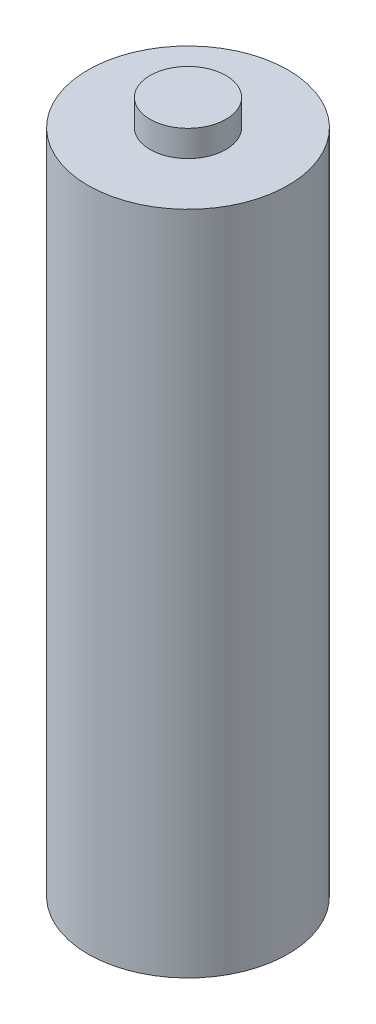
ISO-10303-21;
HEADER;
FILE_DESCRIPTION(('STEP AP214'),'2;1');
FILE_NAME('part.step','',(''),(''),'','','');
FILE_SCHEMA(('AUTOMOTIVE_DESIGN { 1 0 10303 214 1 1 1 1 }'));
ENDSEC;
DATA;
#1=APPLICATION_CONTEXT('core data for automotive mechanical design processes');
#2=APPLICATION_PROTOCOL_DEFINITION('international standard','automotive_design',2000,#1);
#3=PRODUCT_CONTEXT('',#1,'mechanical');
#4=PRODUCT('Part','Part','',(#3));
#5=PRODUCT_RELATED_PRODUCT_CATEGORY('part','',(#4));
#6=PRODUCT_DEFINITION_FORMATION('','',#4);
#7=PRODUCT_DEFINITION_CONTEXT('part definition',#1,'design');
#8=PRODUCT_DEFINITION('design','',#6,#7);
#9=PRODUCT_DEFINITION_SHAPE('','',#8);
#10=(LENGTH_UNIT() NAMED_UNIT(*) SI_UNIT(.MILLI.,.METRE.));
#11=(NAMED_UNIT(*) PLANE_ANGLE_UNIT() SI_UNIT($,.RADIAN.));
#12=(NAMED_UNIT(*) SI_UNIT($,.STERADIAN.) SOLID_ANGLE_UNIT());
#13=UNCERTAINTY_MEASURE_WITH_UNIT(LENGTH_MEASURE(1.E-05),#10,'distance_accuracy_value','');
#14=(GEOMETRIC_REPRESENTATION_CONTEXT(3) GLOBAL_UNCERTAINTY_ASSIGNED_CONTEXT((#13)) GLOBAL_UNIT_ASSIGNED_CONTEXT((#10,
#11,#12)) REPRESENTATION_CONTEXT('',''));
#15=CARTESIAN_POINT('',(0.,0.,0.));
#16=DIRECTION('',(0.,0.,1.));
#17=DIRECTION('',(1.,0.,0.));
#18=AXIS2_PLACEMENT_3D('',#15,#16,#17);
#19=CARTESIAN_POINT('',(0.,50.4,0.));
#20=DIRECTION('',(0.,1.,0.));
#21=DIRECTION('',(0.,0.,1.));
#22=AXIS2_PLACEMENT_3D('',#19,#20,#21);
#23=PLANE('',#22);
#24=CARTESIAN_POINT('',(0.,50.4,0.));
#25=DIRECTION('',(0.,-1.,0.));
#26=DIRECTION('',(0.,0.,-1.));
#27=AXIS2_PLACEMENT_3D('',#24,#25,#26);
#28=CIRCLE('',#27,2.75);
#29=CARTESIAN_POINT('',(0.,50.4,-2.75));
#30=VERTEX_POINT('',#29);
#31=EDGE_CURVE('E10',#30,#30,#28,.T.);
#32=ORIENTED_EDGE('',*,*,#31,.F.);
#33=EDGE_LOOP('',(#32));
#34=FACE_BOUND('',#33,.T.);
#35=ADVANCED_FACE('F34',(#34),#23,.T.);
#36=CARTESIAN_POINT('',(0.,0.,0.));
#37=DIRECTION('',(0.,-1.,0.));
#38=DIRECTION('',(0.,0.,-1.));
#39=AXIS2_PLACEMENT_3D('',#36,#37,#38);
#40=CYLINDRICAL_SURFACE('',#39,2.75);
#41=ORIENTED_EDGE('',*,*,#31,.T.);
#42=EDGE_LOOP('',(#41));
#43=FACE_BOUND('',#42,.T.);
#44=CARTESIAN_POINT('',(0.,48.5,0.));
#45=DIRECTION('',(0.,-1.,0.));
#46=DIRECTION('',(0.,0.,-1.));
#47=AXIS2_PLACEMENT_3D('',#44,#45,#46);
#48=CIRCLE('',#47,2.75);
#49=CARTESIAN_POINT('',(0.,48.5,-2.75));
#50=VERTEX_POINT('',#49);
#51=EDGE_CURVE('E40',#50,#50,#48,.T.);
#52=ORIENTED_EDGE('',*,*,#51,.F.);
#53=EDGE_LOOP('',(#52));
#54=FACE_BOUND('',#53,.T.);
#55=ADVANCED_FACE('F76',(#43,#54),#40,.T.);
#56=CARTESIAN_POINT('',(2.75,48.5,0.));
#57=DIRECTION('',(0.,1.,0.));
#58=DIRECTION('',(0.,0.,1.));
#59=AXIS2_PLACEMENT_3D('',#56,#57,#58);
#60=PLANE('',#59);
#61=ORIENTED_EDGE('',*,*,#51,.T.);
#62=EDGE_LOOP('',(#61));
#63=FACE_BOUND('',#62,.T.);
#64=CARTESIAN_POINT('',(0.,48.5,0.));
#65=DIRECTION('',(0.,-1.,0.));
#66=DIRECTION('',(0.,0.,-1.));
#67=AXIS2_PLACEMENT_3D('',#64,#65,#66);
#68=CIRCLE('',#67,7.25);
#69=CARTESIAN_POINT('',(0.,48.5,-7.25));
#70=VERTEX_POINT('',#69);
#71=EDGE_CURVE('E44',#70,#70,#68,.T.);
#72=ORIENTED_EDGE('',*,*,#71,.F.);
#73=EDGE_LOOP('',(#72));
#74=FACE_BOUND('',#73,.T.);
#75=ADVANCED_FACE('F81',(#63,#74),#60,.T.);
#76=CARTESIAN_POINT('',(0.,0.,0.));
#77=DIRECTION('',(0.,-1.,0.));
#78=DIRECTION('',(0.,0.,-1.));
#79=AXIS2_PLACEMENT_3D('',#76,#77,#78);
#80=CYLINDRICAL_SURFACE('',#79,7.25);
#81=ORIENTED_EDGE('',*,*,#71,.T.);
#82=EDGE_LOOP('',(#81));
#83=FACE_BOUND('',#82,.T.);
#84=CARTESIAN_POINT('',(0.,0.25,0.));
#85=DIRECTION('',(0.,-1.,0.));
#86=DIRECTION('',(0.,0.,-1.));
#87=AXIS2_PLACEMENT_3D('',#84,#85,#86);
#88=CIRCLE('',#87,7.25000000000001);
#89=CARTESIAN_POINT('',(0.,0.25,-7.25000000000001));
#90=VERTEX_POINT('',#89);
#91=EDGE_CURVE('E48',#90,#90,#88,.T.);
#92=ORIENTED_EDGE('',*,*,#91,.F.);
#93=EDGE_LOOP('',(#92));
#94=FACE_BOUND('',#93,.T.);
#95=ADVANCED_FACE('F72',(#83,#94),#80,.T.);
#96=CARTESIAN_POINT('',(7.25000000000001,0.25,0.));
#97=DIRECTION('',(0.,-1.,0.));
#98=DIRECTION('',(0.,0.,-1.));
#99=AXIS2_PLACEMENT_3D('',#96,#97,#98);
#100=PLANE('',#99);
#101=ORIENTED_EDGE('',*,*,#91,.T.);
#102=EDGE_LOOP('',(#101));
#103=FACE_BOUND('',#102,.T.);
#104=CARTESIAN_POINT('',(0.,0.25,0.));
#105=DIRECTION('',(0.,-1.,0.));
#106=DIRECTION('',(0.,0.,-1.));
#107=AXIS2_PLACEMENT_3D('',#104,#105,#106);
#108=CIRCLE('',#107,4.7);
#109=CARTESIAN_POINT('',(0.,0.25,-4.7));
#110=VERTEX_POINT('',#109);
#111=EDGE_CURVE('E53',#110,#110,#108,.T.);
#112=ORIENTED_EDGE('',*,*,#111,.F.);
#113=EDGE_LOOP('',(#112));
#114=FACE_BOUND('',#113,.T.);
#115=ADVANCED_FACE('F64',(#103,#114),#100,.T.);
#116=CARTESIAN_POINT('',(0.,0.,0.));
#117=DIRECTION('',(0.,-1.,0.));
#118=DIRECTION('',(0.,0.,-1.));
#119=AXIS2_PLACEMENT_3D('',#116,#117,#118);
#120=CYLINDRICAL_SURFACE('',#119,4.7);
#121=ORIENTED_EDGE('',*,*,#111,.T.);
#122=EDGE_LOOP('',(#121));
#123=FACE_BOUND('',#122,.T.);
#124=CARTESIAN_POINT('',(0.,0.,0.));
#125=DIRECTION('',(0.,-1.,0.));
#126=DIRECTION('',(0.,0.,-1.));
#127=AXIS2_PLACEMENT_3D('',#124,#125,#126);
#128=CIRCLE('',#127,4.7);
#129=CARTESIAN_POINT('',(0.,0.,-4.7));
#130=VERTEX_POINT('',#129);
#131=EDGE_CURVE('E56',#130,#130,#128,.T.);
#132=ORIENTED_EDGE('',*,*,#131,.F.);
#133=EDGE_LOOP('',(#132));
#134=FACE_BOUND('',#133,.T.);
#135=ADVANCED_FACE('F62',(#123,#134),#120,.T.);
#136=CARTESIAN_POINT('',(4.7,0.,0.));
#137=DIRECTION('',(0.,-1.,0.));
#138=DIRECTION('',(0.,0.,-1.));
#139=AXIS2_PLACEMENT_3D('',#136,#137,#138);
#140=PLANE('',#139);
#141=ORIENTED_EDGE('',*,*,#131,.T.);
#142=EDGE_LOOP('',(#141));
#143=FACE_BOUND('',#142,.T.);
#144=ADVANCED_FACE('F60',(#143),#140,.T.);
#145=CLOSED_SHELL('',(#35,#55,#75,#95,#115,#135,#144));
#146=MANIFOLD_SOLID_BREP('B2',#145);
#147=ADVANCED_BREP_SHAPE_REPRESENTATION('',(#18,#146),#14);
#148=SHAPE_DEFINITION_REPRESENTATION(#9,#147);
ENDSEC;
END-ISO-10303-21;
